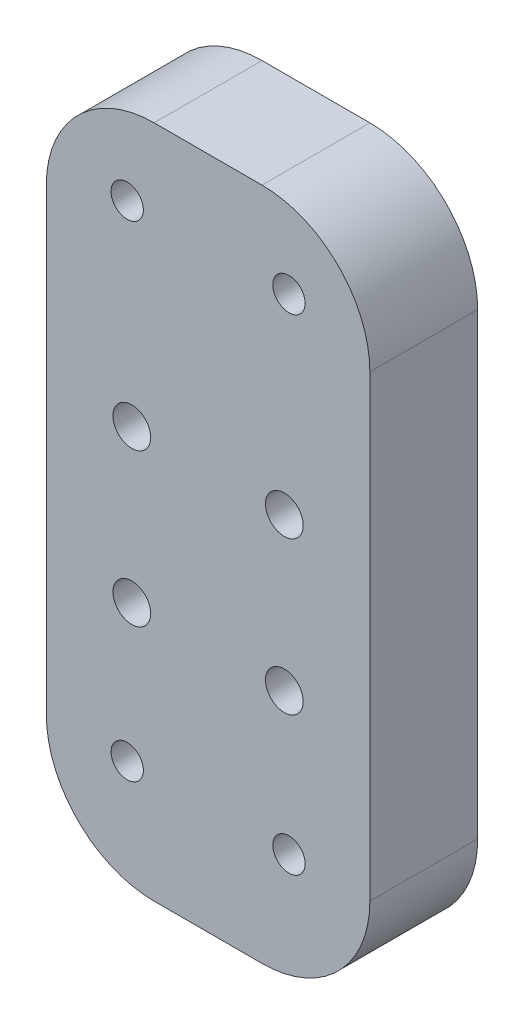
ISO-10303-21;
HEADER;
FILE_DESCRIPTION(('STEP AP214'),'2;1');
FILE_NAME('part.step','',(''),(''),'','','');
FILE_SCHEMA(('AUTOMOTIVE_DESIGN { 1 0 10303 214 1 1 1 1 }'));
ENDSEC;
DATA;
#1=APPLICATION_CONTEXT('core data for automotive mechanical design processes');
#2=APPLICATION_PROTOCOL_DEFINITION('international standard','automotive_design',2000,#1);
#3=PRODUCT_CONTEXT('',#1,'mechanical');
#4=PRODUCT('Part','Part','',(#3));
#5=PRODUCT_RELATED_PRODUCT_CATEGORY('part','',(#4));
#6=PRODUCT_DEFINITION_FORMATION('','',#4);
#7=PRODUCT_DEFINITION_CONTEXT('part definition',#1,'design');
#8=PRODUCT_DEFINITION('design','',#6,#7);
#9=PRODUCT_DEFINITION_SHAPE('','',#8);
#10=(LENGTH_UNIT() NAMED_UNIT(*) SI_UNIT(.MILLI.,.METRE.));
#11=(NAMED_UNIT(*) PLANE_ANGLE_UNIT() SI_UNIT($,.RADIAN.));
#12=(NAMED_UNIT(*) SI_UNIT($,.STERADIAN.) SOLID_ANGLE_UNIT());
#13=UNCERTAINTY_MEASURE_WITH_UNIT(LENGTH_MEASURE(1.E-05),#10,'distance_accuracy_value','');
#14=(GEOMETRIC_REPRESENTATION_CONTEXT(3) GLOBAL_UNCERTAINTY_ASSIGNED_CONTEXT((#13)) GLOBAL_UNIT_ASSIGNED_CONTEXT((#10,
#11,#12)) REPRESENTATION_CONTEXT('',''));
#15=CARTESIAN_POINT('',(0.,0.,0.));
#16=DIRECTION('',(0.,0.,1.));
#17=DIRECTION('',(1.,0.,0.));
#18=AXIS2_PLACEMENT_3D('',#15,#16,#17);
#19=CARTESIAN_POINT('',(0.,0.,10.));
#20=DIRECTION('',(0.,0.,1.));
#21=DIRECTION('',(1.,0.,0.));
#22=AXIS2_PLACEMENT_3D('',#19,#20,#21);
#23=PLANE('',#22);
#24=CARTESIAN_POINT('',(7.5,-20.,10.));
#25=DIRECTION('',(0.,0.,1.));
#26=DIRECTION('',(1.,0.,0.));
#27=AXIS2_PLACEMENT_3D('',#24,#25,#26);
#28=CIRCLE('',#27,1.5);
#29=CARTESIAN_POINT('',(9.,-20.,10.));
#30=VERTEX_POINT('',#29);
#31=EDGE_CURVE('E248',#30,#30,#28,.T.);
#32=ORIENTED_EDGE('',*,*,#31,.F.);
#33=EDGE_LOOP('',(#32));
#34=FACE_BOUND('',#33,.T.);
#35=CARTESIAN_POINT('',(7.5,25.,10.));
#36=DIRECTION('',(0.,0.,1.));
#37=DIRECTION('',(1.,0.,0.));
#38=AXIS2_PLACEMENT_3D('',#35,#36,#37);
#39=CIRCLE('',#38,1.5);
#40=CARTESIAN_POINT('',(9.,25.,10.));
#41=VERTEX_POINT('',#40);
#42=EDGE_CURVE('E232',#41,#41,#39,.T.);
#43=ORIENTED_EDGE('',*,*,#42,.F.);
#44=EDGE_LOOP('',(#43));
#45=FACE_BOUND('',#44,.T.);
#46=CARTESIAN_POINT('',(7.07106781186546,-7.07106781186548,10.));
#47=DIRECTION('',(0.,0.,1.));
#48=DIRECTION('',(1.,0.,0.));
#49=AXIS2_PLACEMENT_3D('',#46,#47,#48);
#50=CIRCLE('',#49,1.75);
#51=CARTESIAN_POINT('',(8.82106781186546,-7.07106781186548,10.));
#52=VERTEX_POINT('',#51);
#53=EDGE_CURVE('E216',#52,#52,#50,.T.);
#54=ORIENTED_EDGE('',*,*,#53,.F.);
#55=EDGE_LOOP('',(#54));
#56=FACE_BOUND('',#55,.T.);
#57=CARTESIAN_POINT('',(-7.07106781186547,7.0710678118655,10.));
#58=DIRECTION('',(0.,0.,1.));
#59=DIRECTION('',(1.,0.,0.));
#60=AXIS2_PLACEMENT_3D('',#57,#58,#59);
#61=CIRCLE('',#60,1.75);
#62=CARTESIAN_POINT('',(-5.32106781186547,7.0710678118655,10.));
#63=VERTEX_POINT('',#62);
#64=EDGE_CURVE('E193',#63,#63,#61,.T.);
#65=ORIENTED_EDGE('',*,*,#64,.F.);
#66=EDGE_LOOP('',(#65));
#67=FACE_BOUND('',#66,.T.);
#68=DIRECTION('',(0.,-1.,0.));
#69=VECTOR('',#68,1.);
#70=CARTESIAN_POINT('',(-15.0000000000001,32.5,10.));
#71=LINE('',#70,#69);
#72=CARTESIAN_POINT('',(-15.0000000000001,22.5,10.));
#73=VERTEX_POINT('',#72);
#74=CARTESIAN_POINT('',(-15.0000000000001,-20.,10.));
#75=VERTEX_POINT('',#74);
#76=EDGE_CURVE('E198',#73,#75,#71,.T.);
#77=ORIENTED_EDGE('',*,*,#76,.T.);
#78=CARTESIAN_POINT('',(-5.00000000000013,-20.,10.));
#79=DIRECTION('',(0.,0.,1.));
#80=DIRECTION('',(1.,0.,0.));
#81=AXIS2_PLACEMENT_3D('',#78,#79,#80);
#82=CIRCLE('',#81,10.);
#83=CARTESIAN_POINT('',(-5.00000000000013,-30.,10.));
#84=VERTEX_POINT('',#83);
#85=EDGE_CURVE('E174',#75,#84,#82,.T.);
#86=ORIENTED_EDGE('',*,*,#85,.T.);
#87=DIRECTION('',(1.,0.,0.));
#88=VECTOR('',#87,1.);
#89=CARTESIAN_POINT('',(-15.0000000000001,-30.,10.));
#90=LINE('',#89,#88);
#91=CARTESIAN_POINT('',(5.00000000000013,-30.,10.));
#92=VERTEX_POINT('',#91);
#93=EDGE_CURVE('E132',#84,#92,#90,.T.);
#94=ORIENTED_EDGE('',*,*,#93,.T.);
#95=CARTESIAN_POINT('',(5.00000000000013,-20.,10.));
#96=DIRECTION('',(0.,0.,1.));
#97=DIRECTION('',(1.,0.,0.));
#98=AXIS2_PLACEMENT_3D('',#95,#96,#97);
#99=CIRCLE('',#98,10.);
#100=CARTESIAN_POINT('',(15.0000000000001,-20.,10.));
#101=VERTEX_POINT('',#100);
#102=EDGE_CURVE('E171',#92,#101,#99,.T.);
#103=ORIENTED_EDGE('',*,*,#102,.T.);
#104=DIRECTION('',(0.,1.,0.));
#105=VECTOR('',#104,1.);
#106=CARTESIAN_POINT('',(15.0000000000001,32.5,10.));
#107=LINE('',#106,#105);
#108=CARTESIAN_POINT('',(15.0000000000001,22.5,10.));
#109=VERTEX_POINT('',#108);
#110=EDGE_CURVE('E141',#101,#109,#107,.T.);
#111=ORIENTED_EDGE('',*,*,#110,.T.);
#112=CARTESIAN_POINT('',(5.00000000000012,22.5,10.));
#113=DIRECTION('',(0.,0.,1.));
#114=DIRECTION('',(1.,0.,0.));
#115=AXIS2_PLACEMENT_3D('',#112,#113,#114);
#116=CIRCLE('',#115,10.);
#117=CARTESIAN_POINT('',(5.00000000000012,32.5,10.));
#118=VERTEX_POINT('',#117);
#119=EDGE_CURVE('E66',#109,#118,#116,.T.);
#120=ORIENTED_EDGE('',*,*,#119,.T.);
#121=DIRECTION('',(-1.,0.,0.));
#122=VECTOR('',#121,1.);
#123=CARTESIAN_POINT('',(-15.0000000000001,32.5,10.));
#124=LINE('',#123,#122);
#125=CARTESIAN_POINT('',(-5.00000000000013,32.5,10.));
#126=VERTEX_POINT('',#125);
#127=EDGE_CURVE('E146',#118,#126,#124,.T.);
#128=ORIENTED_EDGE('',*,*,#127,.T.);
#129=CARTESIAN_POINT('',(-5.00000000000013,22.5,10.));
#130=DIRECTION('',(0.,0.,1.));
#131=DIRECTION('',(1.,0.,0.));
#132=AXIS2_PLACEMENT_3D('',#129,#130,#131);
#133=CIRCLE('',#132,10.);
#134=EDGE_CURVE('E168',#126,#73,#133,.T.);
#135=ORIENTED_EDGE('',*,*,#134,.T.);
#136=EDGE_LOOP('',(#77,#86,#94,#103,#111,#120,#128,#135));
#137=FACE_BOUND('',#136,.T.);
#138=CARTESIAN_POINT('',(7.07106781186546,7.0710678118655,10.));
#139=DIRECTION('',(0.,0.,1.));
#140=DIRECTION('',(1.,0.,0.));
#141=AXIS2_PLACEMENT_3D('',#138,#139,#140);
#142=CIRCLE('',#141,1.75);
#143=CARTESIAN_POINT('',(8.82106781186546,7.0710678118655,10.));
#144=VERTEX_POINT('',#143);
#145=EDGE_CURVE('E208',#144,#144,#142,.T.);
#146=ORIENTED_EDGE('',*,*,#145,.F.);
#147=EDGE_LOOP('',(#146));
#148=FACE_BOUND('',#147,.T.);
#149=CARTESIAN_POINT('',(-7.07106781186547,-7.07106781186548,10.));
#150=DIRECTION('',(0.,0.,1.));
#151=DIRECTION('',(1.,0.,0.));
#152=AXIS2_PLACEMENT_3D('',#149,#150,#151);
#153=CIRCLE('',#152,1.75);
#154=CARTESIAN_POINT('',(-5.32106781186547,-7.07106781186548,10.));
#155=VERTEX_POINT('',#154);
#156=EDGE_CURVE('E224',#155,#155,#153,.T.);
#157=ORIENTED_EDGE('',*,*,#156,.F.);
#158=EDGE_LOOP('',(#157));
#159=FACE_BOUND('',#158,.T.);
#160=CARTESIAN_POINT('',(-7.5,25.,10.));
#161=DIRECTION('',(0.,0.,1.));
#162=DIRECTION('',(1.,0.,0.));
#163=AXIS2_PLACEMENT_3D('',#160,#161,#162);
#164=CIRCLE('',#163,1.5);
#165=CARTESIAN_POINT('',(-6.,25.,10.));
#166=VERTEX_POINT('',#165);
#167=EDGE_CURVE('E240',#166,#166,#164,.T.);
#168=ORIENTED_EDGE('',*,*,#167,.F.);
#169=EDGE_LOOP('',(#168));
#170=FACE_BOUND('',#169,.T.);
#171=CARTESIAN_POINT('',(-7.5,-20.,10.));
#172=DIRECTION('',(0.,0.,1.));
#173=DIRECTION('',(1.,0.,0.));
#174=AXIS2_PLACEMENT_3D('',#171,#172,#173);
#175=CIRCLE('',#174,1.5);
#176=CARTESIAN_POINT('',(-6.,-20.,10.));
#177=VERTEX_POINT('',#176);
#178=EDGE_CURVE('E256',#177,#177,#175,.T.);
#179=ORIENTED_EDGE('',*,*,#178,.F.);
#180=EDGE_LOOP('',(#179));
#181=FACE_BOUND('',#180,.T.);
#182=ADVANCED_FACE('F45',(#34,#45,#56,#67,#137,#148,#159,#170,#181),#23,.T.);
#183=CARTESIAN_POINT('',(0.,0.,0.));
#184=DIRECTION('',(0.,0.,1.));
#185=DIRECTION('',(1.,0.,0.));
#186=AXIS2_PLACEMENT_3D('',#183,#184,#185);
#187=PLANE('',#186);
#188=DIRECTION('',(1.,0.,0.));
#189=VECTOR('',#188,1.);
#190=CARTESIAN_POINT('',(-15.0000000000001,-30.,0.));
#191=LINE('',#190,#189);
#192=CARTESIAN_POINT('',(-5.00000000000013,-30.,0.));
#193=VERTEX_POINT('',#192);
#194=CARTESIAN_POINT('',(5.00000000000013,-30.,0.));
#195=VERTEX_POINT('',#194);
#196=EDGE_CURVE('E129',#193,#195,#191,.T.);
#197=ORIENTED_EDGE('',*,*,#196,.F.);
#198=CARTESIAN_POINT('',(-5.00000000000013,-20.,0.));
#199=DIRECTION('',(0.,0.,1.));
#200=DIRECTION('',(1.,0.,0.));
#201=AXIS2_PLACEMENT_3D('',#198,#199,#200);
#202=CIRCLE('',#201,10.);
#203=CARTESIAN_POINT('',(-15.0000000000001,-20.,0.));
#204=VERTEX_POINT('',#203);
#205=EDGE_CURVE('E111',#193,#204,#202,.F.);
#206=ORIENTED_EDGE('',*,*,#205,.T.);
#207=DIRECTION('',(0.,-1.,0.));
#208=VECTOR('',#207,1.);
#209=CARTESIAN_POINT('',(-15.0000000000001,32.5,0.));
#210=LINE('',#209,#208);
#211=CARTESIAN_POINT('',(-15.0000000000001,22.5,0.));
#212=VERTEX_POINT('',#211);
#213=EDGE_CURVE('E142',#212,#204,#210,.T.);
#214=ORIENTED_EDGE('',*,*,#213,.F.);
#215=CARTESIAN_POINT('',(-5.00000000000013,22.5,0.));
#216=DIRECTION('',(0.,0.,1.));
#217=DIRECTION('',(1.,0.,0.));
#218=AXIS2_PLACEMENT_3D('',#215,#216,#217);
#219=CIRCLE('',#218,10.);
#220=CARTESIAN_POINT('',(-5.00000000000013,32.5,0.));
#221=VERTEX_POINT('',#220);
#222=EDGE_CURVE('E156',#212,#221,#219,.F.);
#223=ORIENTED_EDGE('',*,*,#222,.T.);
#224=DIRECTION('',(-1.,0.,0.));
#225=VECTOR('',#224,1.);
#226=CARTESIAN_POINT('',(-15.0000000000001,32.5,0.));
#227=LINE('',#226,#225);
#228=CARTESIAN_POINT('',(5.00000000000012,32.5,0.));
#229=VERTEX_POINT('',#228);
#230=EDGE_CURVE('E148',#229,#221,#227,.T.);
#231=ORIENTED_EDGE('',*,*,#230,.F.);
#232=CARTESIAN_POINT('',(5.00000000000012,22.5,0.));
#233=DIRECTION('',(0.,0.,1.));
#234=DIRECTION('',(1.,0.,0.));
#235=AXIS2_PLACEMENT_3D('',#232,#233,#234);
#236=CIRCLE('',#235,10.);
#237=CARTESIAN_POINT('',(15.0000000000001,22.5,0.));
#238=VERTEX_POINT('',#237);
#239=EDGE_CURVE('E134',#229,#238,#236,.F.);
#240=ORIENTED_EDGE('',*,*,#239,.T.);
#241=DIRECTION('',(0.,1.,0.));
#242=VECTOR('',#241,1.);
#243=CARTESIAN_POINT('',(15.0000000000001,32.5,0.));
#244=LINE('',#243,#242);
#245=CARTESIAN_POINT('',(15.0000000000001,-20.,0.));
#246=VERTEX_POINT('',#245);
#247=EDGE_CURVE('E191',#246,#238,#244,.T.);
#248=ORIENTED_EDGE('',*,*,#247,.F.);
#249=CARTESIAN_POINT('',(5.00000000000013,-20.,0.));
#250=DIRECTION('',(0.,0.,1.));
#251=DIRECTION('',(1.,0.,0.));
#252=AXIS2_PLACEMENT_3D('',#249,#250,#251);
#253=CIRCLE('',#252,10.);
#254=EDGE_CURVE('E123',#246,#195,#253,.F.);
#255=ORIENTED_EDGE('',*,*,#254,.T.);
#256=EDGE_LOOP('',(#197,#206,#214,#223,#231,#240,#248,#255));
#257=FACE_BOUND('',#256,.T.);
#258=CARTESIAN_POINT('',(-7.07106781186547,7.0710678118655,0.));
#259=DIRECTION('',(0.,0.,1.));
#260=DIRECTION('',(1.,0.,0.));
#261=AXIS2_PLACEMENT_3D('',#258,#259,#260);
#262=CIRCLE('',#261,1.75);
#263=CARTESIAN_POINT('',(-5.32106781186547,7.0710678118655,0.));
#264=VERTEX_POINT('',#263);
#265=EDGE_CURVE('E204',#264,#264,#262,.T.);
#266=ORIENTED_EDGE('',*,*,#265,.T.);
#267=EDGE_LOOP('',(#266));
#268=FACE_BOUND('',#267,.T.);
#269=CARTESIAN_POINT('',(7.07106781186546,7.0710678118655,0.));
#270=DIRECTION('',(0.,0.,1.));
#271=DIRECTION('',(1.,0.,0.));
#272=AXIS2_PLACEMENT_3D('',#269,#270,#271);
#273=CIRCLE('',#272,1.75);
#274=CARTESIAN_POINT('',(8.82106781186546,7.0710678118655,0.));
#275=VERTEX_POINT('',#274);
#276=EDGE_CURVE('E212',#275,#275,#273,.T.);
#277=ORIENTED_EDGE('',*,*,#276,.T.);
#278=EDGE_LOOP('',(#277));
#279=FACE_BOUND('',#278,.T.);
#280=CARTESIAN_POINT('',(7.07106781186546,-7.07106781186548,0.));
#281=DIRECTION('',(0.,0.,1.));
#282=DIRECTION('',(1.,0.,0.));
#283=AXIS2_PLACEMENT_3D('',#280,#281,#282);
#284=CIRCLE('',#283,1.75);
#285=CARTESIAN_POINT('',(8.82106781186546,-7.07106781186548,0.));
#286=VERTEX_POINT('',#285);
#287=EDGE_CURVE('E220',#286,#286,#284,.T.);
#288=ORIENTED_EDGE('',*,*,#287,.T.);
#289=EDGE_LOOP('',(#288));
#290=FACE_BOUND('',#289,.T.);
#291=CARTESIAN_POINT('',(-7.07106781186547,-7.07106781186548,0.));
#292=DIRECTION('',(0.,0.,1.));
#293=DIRECTION('',(1.,0.,0.));
#294=AXIS2_PLACEMENT_3D('',#291,#292,#293);
#295=CIRCLE('',#294,1.75);
#296=CARTESIAN_POINT('',(-5.32106781186547,-7.07106781186548,0.));
#297=VERTEX_POINT('',#296);
#298=EDGE_CURVE('E228',#297,#297,#295,.T.);
#299=ORIENTED_EDGE('',*,*,#298,.T.);
#300=EDGE_LOOP('',(#299));
#301=FACE_BOUND('',#300,.T.);
#302=CARTESIAN_POINT('',(7.5,25.,0.));
#303=DIRECTION('',(0.,0.,1.));
#304=DIRECTION('',(1.,0.,0.));
#305=AXIS2_PLACEMENT_3D('',#302,#303,#304);
#306=CIRCLE('',#305,1.5);
#307=CARTESIAN_POINT('',(9.,25.,0.));
#308=VERTEX_POINT('',#307);
#309=EDGE_CURVE('E236',#308,#308,#306,.T.);
#310=ORIENTED_EDGE('',*,*,#309,.T.);
#311=EDGE_LOOP('',(#310));
#312=FACE_BOUND('',#311,.T.);
#313=CARTESIAN_POINT('',(-7.5,25.,0.));
#314=DIRECTION('',(0.,0.,1.));
#315=DIRECTION('',(1.,0.,0.));
#316=AXIS2_PLACEMENT_3D('',#313,#314,#315);
#317=CIRCLE('',#316,1.5);
#318=CARTESIAN_POINT('',(-6.,25.,0.));
#319=VERTEX_POINT('',#318);
#320=EDGE_CURVE('E244',#319,#319,#317,.T.);
#321=ORIENTED_EDGE('',*,*,#320,.T.);
#322=EDGE_LOOP('',(#321));
#323=FACE_BOUND('',#322,.T.);
#324=CARTESIAN_POINT('',(7.5,-20.,0.));
#325=DIRECTION('',(0.,0.,1.));
#326=DIRECTION('',(1.,0.,0.));
#327=AXIS2_PLACEMENT_3D('',#324,#325,#326);
#328=CIRCLE('',#327,1.5);
#329=CARTESIAN_POINT('',(9.,-20.,0.));
#330=VERTEX_POINT('',#329);
#331=EDGE_CURVE('E252',#330,#330,#328,.T.);
#332=ORIENTED_EDGE('',*,*,#331,.T.);
#333=EDGE_LOOP('',(#332));
#334=FACE_BOUND('',#333,.T.);
#335=CARTESIAN_POINT('',(-7.5,-20.,0.));
#336=DIRECTION('',(0.,0.,1.));
#337=DIRECTION('',(1.,0.,0.));
#338=AXIS2_PLACEMENT_3D('',#335,#336,#337);
#339=CIRCLE('',#338,1.5);
#340=CARTESIAN_POINT('',(-6.,-20.,0.));
#341=VERTEX_POINT('',#340);
#342=EDGE_CURVE('E260',#341,#341,#339,.T.);
#343=ORIENTED_EDGE('',*,*,#342,.T.);
#344=EDGE_LOOP('',(#343));
#345=FACE_BOUND('',#344,.T.);
#346=ADVANCED_FACE('F137',(#257,#268,#279,#290,#301,#312,#323,#334,#345),#187,.F.);
#347=CARTESIAN_POINT('',(15.0000000000001,32.5,10.));
#348=DIRECTION('',(-1.,0.,0.));
#349=DIRECTION('',(0.,-1.,0.));
#350=AXIS2_PLACEMENT_3D('',#347,#348,#349);
#351=PLANE('',#350);
#352=ORIENTED_EDGE('',*,*,#110,.F.);
#353=DIRECTION('',(0.,0.,-1.));
#354=VECTOR('',#353,1.);
#355=CARTESIAN_POINT('',(15.0000000000001,-20.,10.));
#356=LINE('',#355,#354);
#357=EDGE_CURVE('E180',#101,#246,#356,.T.);
#358=ORIENTED_EDGE('',*,*,#357,.T.);
#359=ORIENTED_EDGE('',*,*,#247,.T.);
#360=DIRECTION('',(0.,0.,-1.));
#361=VECTOR('',#360,1.);
#362=CARTESIAN_POINT('',(15.0000000000001,22.5,10.));
#363=LINE('',#362,#361);
#364=EDGE_CURVE('E177',#238,#109,#363,.F.);
#365=ORIENTED_EDGE('',*,*,#364,.T.);
#366=EDGE_LOOP('',(#352,#358,#359,#365));
#367=FACE_BOUND('',#366,.T.);
#368=ADVANCED_FACE('F278',(#367),#351,.F.);
#369=CARTESIAN_POINT('',(-15.0000000000001,32.5,10.));
#370=DIRECTION('',(0.,-1.,0.));
#371=DIRECTION('',(0.,0.,-1.));
#372=AXIS2_PLACEMENT_3D('',#369,#370,#371);
#373=PLANE('',#372);
#374=ORIENTED_EDGE('',*,*,#230,.T.);
#375=DIRECTION('',(0.,0.,-1.));
#376=VECTOR('',#375,1.);
#377=CARTESIAN_POINT('',(-5.00000000000013,32.5,10.));
#378=LINE('',#377,#376);
#379=EDGE_CURVE('E11',#221,#126,#378,.F.);
#380=ORIENTED_EDGE('',*,*,#379,.T.);
#381=ORIENTED_EDGE('',*,*,#127,.F.);
#382=DIRECTION('',(0.,0.,-1.));
#383=VECTOR('',#382,1.);
#384=CARTESIAN_POINT('',(5.00000000000012,32.5,10.));
#385=LINE('',#384,#383);
#386=EDGE_CURVE('E54',#118,#229,#385,.T.);
#387=ORIENTED_EDGE('',*,*,#386,.T.);
#388=EDGE_LOOP('',(#374,#380,#381,#387));
#389=FACE_BOUND('',#388,.T.);
#390=ADVANCED_FACE('F187',(#389),#373,.F.);
#391=CARTESIAN_POINT('',(-15.0000000000001,32.5,10.));
#392=DIRECTION('',(1.,0.,0.));
#393=DIRECTION('',(0.,1.,0.));
#394=AXIS2_PLACEMENT_3D('',#391,#392,#393);
#395=PLANE('',#394);
#396=ORIENTED_EDGE('',*,*,#213,.T.);
#397=DIRECTION('',(0.,0.,-1.));
#398=VECTOR('',#397,1.);
#399=CARTESIAN_POINT('',(-15.0000000000001,-20.,10.));
#400=LINE('',#399,#398);
#401=EDGE_CURVE('E116',#204,#75,#400,.F.);
#402=ORIENTED_EDGE('',*,*,#401,.T.);
#403=ORIENTED_EDGE('',*,*,#76,.F.);
#404=DIRECTION('',(0.,0.,-1.));
#405=VECTOR('',#404,1.);
#406=CARTESIAN_POINT('',(-15.0000000000001,22.5,10.));
#407=LINE('',#406,#405);
#408=EDGE_CURVE('E122',#73,#212,#407,.T.);
#409=ORIENTED_EDGE('',*,*,#408,.T.);
#410=EDGE_LOOP('',(#396,#402,#403,#409));
#411=FACE_BOUND('',#410,.T.);
#412=ADVANCED_FACE('F288',(#411),#395,.F.);
#413=CARTESIAN_POINT('',(-15.0000000000001,-30.,10.));
#414=DIRECTION('',(0.,1.,0.));
#415=DIRECTION('',(0.,0.,1.));
#416=AXIS2_PLACEMENT_3D('',#413,#414,#415);
#417=PLANE('',#416);
#418=ORIENTED_EDGE('',*,*,#93,.F.);
#419=DIRECTION('',(0.,0.,-1.));
#420=VECTOR('',#419,1.);
#421=CARTESIAN_POINT('',(-5.00000000000013,-30.,10.));
#422=LINE('',#421,#420);
#423=EDGE_CURVE('E115',#84,#193,#422,.T.);
#424=ORIENTED_EDGE('',*,*,#423,.T.);
#425=ORIENTED_EDGE('',*,*,#196,.T.);
#426=DIRECTION('',(0.,0.,-1.));
#427=VECTOR('',#426,1.);
#428=CARTESIAN_POINT('',(5.00000000000013,-30.,10.));
#429=LINE('',#428,#427);
#430=EDGE_CURVE('E135',#195,#92,#429,.F.);
#431=ORIENTED_EDGE('',*,*,#430,.T.);
#432=EDGE_LOOP('',(#418,#424,#425,#431));
#433=FACE_BOUND('',#432,.T.);
#434=ADVANCED_FACE('F128',(#433),#417,.F.);
#435=CARTESIAN_POINT('',(-7.07106781186547,7.0710678118655,10.));
#436=DIRECTION('',(0.,0.,-1.));
#437=DIRECTION('',(-1.,0.,0.));
#438=AXIS2_PLACEMENT_3D('',#435,#436,#437);
#439=CYLINDRICAL_SURFACE('',#438,1.75);
#440=ORIENTED_EDGE('',*,*,#64,.T.);
#441=EDGE_LOOP('',(#440));
#442=FACE_BOUND('',#441,.T.);
#443=ORIENTED_EDGE('',*,*,#265,.F.);
#444=EDGE_LOOP('',(#443));
#445=FACE_BOUND('',#444,.T.);
#446=ADVANCED_FACE('F283',(#442,#445),#439,.F.);
#447=CARTESIAN_POINT('',(7.07106781186546,7.0710678118655,10.));
#448=DIRECTION('',(0.,0.,-1.));
#449=DIRECTION('',(-1.,0.,0.));
#450=AXIS2_PLACEMENT_3D('',#447,#448,#449);
#451=CYLINDRICAL_SURFACE('',#450,1.75);
#452=ORIENTED_EDGE('',*,*,#145,.T.);
#453=EDGE_LOOP('',(#452));
#454=FACE_BOUND('',#453,.T.);
#455=ORIENTED_EDGE('',*,*,#276,.F.);
#456=EDGE_LOOP('',(#455));
#457=FACE_BOUND('',#456,.T.);
#458=ADVANCED_FACE('F350',(#454,#457),#451,.F.);
#459=CARTESIAN_POINT('',(7.07106781186546,-7.07106781186548,10.));
#460=DIRECTION('',(0.,0.,-1.));
#461=DIRECTION('',(-1.,0.,0.));
#462=AXIS2_PLACEMENT_3D('',#459,#460,#461);
#463=CYLINDRICAL_SURFACE('',#462,1.75);
#464=ORIENTED_EDGE('',*,*,#53,.T.);
#465=EDGE_LOOP('',(#464));
#466=FACE_BOUND('',#465,.T.);
#467=ORIENTED_EDGE('',*,*,#287,.F.);
#468=EDGE_LOOP('',(#467));
#469=FACE_BOUND('',#468,.T.);
#470=ADVANCED_FACE('F347',(#466,#469),#463,.F.);
#471=CARTESIAN_POINT('',(-7.07106781186547,-7.07106781186548,10.));
#472=DIRECTION('',(0.,0.,-1.));
#473=DIRECTION('',(-1.,0.,0.));
#474=AXIS2_PLACEMENT_3D('',#471,#472,#473);
#475=CYLINDRICAL_SURFACE('',#474,1.75);
#476=ORIENTED_EDGE('',*,*,#156,.T.);
#477=EDGE_LOOP('',(#476));
#478=FACE_BOUND('',#477,.T.);
#479=ORIENTED_EDGE('',*,*,#298,.F.);
#480=EDGE_LOOP('',(#479));
#481=FACE_BOUND('',#480,.T.);
#482=ADVANCED_FACE('F343',(#478,#481),#475,.F.);
#483=CARTESIAN_POINT('',(7.5,25.,10.));
#484=DIRECTION('',(0.,0.,-1.));
#485=DIRECTION('',(-1.,0.,0.));
#486=AXIS2_PLACEMENT_3D('',#483,#484,#485);
#487=CYLINDRICAL_SURFACE('',#486,1.5);
#488=ORIENTED_EDGE('',*,*,#42,.T.);
#489=EDGE_LOOP('',(#488));
#490=FACE_BOUND('',#489,.T.);
#491=ORIENTED_EDGE('',*,*,#309,.F.);
#492=EDGE_LOOP('',(#491));
#493=FACE_BOUND('',#492,.T.);
#494=ADVANCED_FACE('F326',(#490,#493),#487,.F.);
#495=CARTESIAN_POINT('',(-7.5,25.,10.));
#496=DIRECTION('',(0.,0.,-1.));
#497=DIRECTION('',(-1.,0.,0.));
#498=AXIS2_PLACEMENT_3D('',#495,#496,#497);
#499=CYLINDRICAL_SURFACE('',#498,1.5);
#500=ORIENTED_EDGE('',*,*,#167,.T.);
#501=EDGE_LOOP('',(#500));
#502=FACE_BOUND('',#501,.T.);
#503=ORIENTED_EDGE('',*,*,#320,.F.);
#504=EDGE_LOOP('',(#503));
#505=FACE_BOUND('',#504,.T.);
#506=ADVANCED_FACE('F322',(#502,#505),#499,.F.);
#507=CARTESIAN_POINT('',(7.5,-20.,10.));
#508=DIRECTION('',(0.,0.,-1.));
#509=DIRECTION('',(-1.,0.,0.));
#510=AXIS2_PLACEMENT_3D('',#507,#508,#509);
#511=CYLINDRICAL_SURFACE('',#510,1.5);
#512=ORIENTED_EDGE('',*,*,#31,.T.);
#513=EDGE_LOOP('',(#512));
#514=FACE_BOUND('',#513,.T.);
#515=ORIENTED_EDGE('',*,*,#331,.F.);
#516=EDGE_LOOP('',(#515));
#517=FACE_BOUND('',#516,.T.);
#518=ADVANCED_FACE('F325',(#514,#517),#511,.F.);
#519=CARTESIAN_POINT('',(-7.5,-20.,10.));
#520=DIRECTION('',(0.,0.,-1.));
#521=DIRECTION('',(-1.,0.,0.));
#522=AXIS2_PLACEMENT_3D('',#519,#520,#521);
#523=CYLINDRICAL_SURFACE('',#522,1.5);
#524=ORIENTED_EDGE('',*,*,#178,.T.);
#525=EDGE_LOOP('',(#524));
#526=FACE_BOUND('',#525,.T.);
#527=ORIENTED_EDGE('',*,*,#342,.F.);
#528=EDGE_LOOP('',(#527));
#529=FACE_BOUND('',#528,.T.);
#530=ADVANCED_FACE('F268',(#526,#529),#523,.F.);
#531=CARTESIAN_POINT('',(-5.00000000000013,-20.,10.));
#532=DIRECTION('',(0.,0.,-1.));
#533=DIRECTION('',(-1.,0.,0.));
#534=AXIS2_PLACEMENT_3D('',#531,#532,#533);
#535=CYLINDRICAL_SURFACE('',#534,10.);
#536=ORIENTED_EDGE('',*,*,#85,.F.);
#537=ORIENTED_EDGE('',*,*,#401,.F.);
#538=ORIENTED_EDGE('',*,*,#205,.F.);
#539=ORIENTED_EDGE('',*,*,#423,.F.);
#540=EDGE_LOOP('',(#536,#537,#538,#539));
#541=FACE_BOUND('',#540,.T.);
#542=ADVANCED_FACE('F114',(#541),#535,.T.);
#543=CARTESIAN_POINT('',(5.00000000000013,-20.,10.));
#544=DIRECTION('',(0.,0.,-1.));
#545=DIRECTION('',(-1.,0.,0.));
#546=AXIS2_PLACEMENT_3D('',#543,#544,#545);
#547=CYLINDRICAL_SURFACE('',#546,10.);
#548=ORIENTED_EDGE('',*,*,#102,.F.);
#549=ORIENTED_EDGE('',*,*,#430,.F.);
#550=ORIENTED_EDGE('',*,*,#254,.F.);
#551=ORIENTED_EDGE('',*,*,#357,.F.);
#552=EDGE_LOOP('',(#548,#549,#550,#551));
#553=FACE_BOUND('',#552,.T.);
#554=ADVANCED_FACE('F299',(#553),#547,.T.);
#555=CARTESIAN_POINT('',(-5.00000000000013,22.5,10.));
#556=DIRECTION('',(0.,0.,-1.));
#557=DIRECTION('',(-1.,0.,0.));
#558=AXIS2_PLACEMENT_3D('',#555,#556,#557);
#559=CYLINDRICAL_SURFACE('',#558,10.);
#560=ORIENTED_EDGE('',*,*,#134,.F.);
#561=ORIENTED_EDGE('',*,*,#379,.F.);
#562=ORIENTED_EDGE('',*,*,#222,.F.);
#563=ORIENTED_EDGE('',*,*,#408,.F.);
#564=EDGE_LOOP('',(#560,#561,#562,#563));
#565=FACE_BOUND('',#564,.T.);
#566=ADVANCED_FACE('F301',(#565),#559,.T.);
#567=CARTESIAN_POINT('',(5.00000000000012,22.5,10.));
#568=DIRECTION('',(0.,0.,-1.));
#569=DIRECTION('',(-1.,0.,0.));
#570=AXIS2_PLACEMENT_3D('',#567,#568,#569);
#571=CYLINDRICAL_SURFACE('',#570,10.);
#572=ORIENTED_EDGE('',*,*,#119,.F.);
#573=ORIENTED_EDGE('',*,*,#364,.F.);
#574=ORIENTED_EDGE('',*,*,#239,.F.);
#575=ORIENTED_EDGE('',*,*,#386,.F.);
#576=EDGE_LOOP('',(#572,#573,#574,#575));
#577=FACE_BOUND('',#576,.T.);
#578=ADVANCED_FACE('F47',(#577),#571,.T.);
#579=CLOSED_SHELL('',(#182,#346,#368,#390,#412,#434,#446,#458,#470,#482,#494,#506,#518,#530,
#542,#554,#566,#578));
#580=MANIFOLD_SOLID_BREP('B2',#579);
#581=ADVANCED_BREP_SHAPE_REPRESENTATION('',(#18,#580),#14);
#582=SHAPE_DEFINITION_REPRESENTATION(#9,#581);
ENDSEC;
END-ISO-10303-21;
